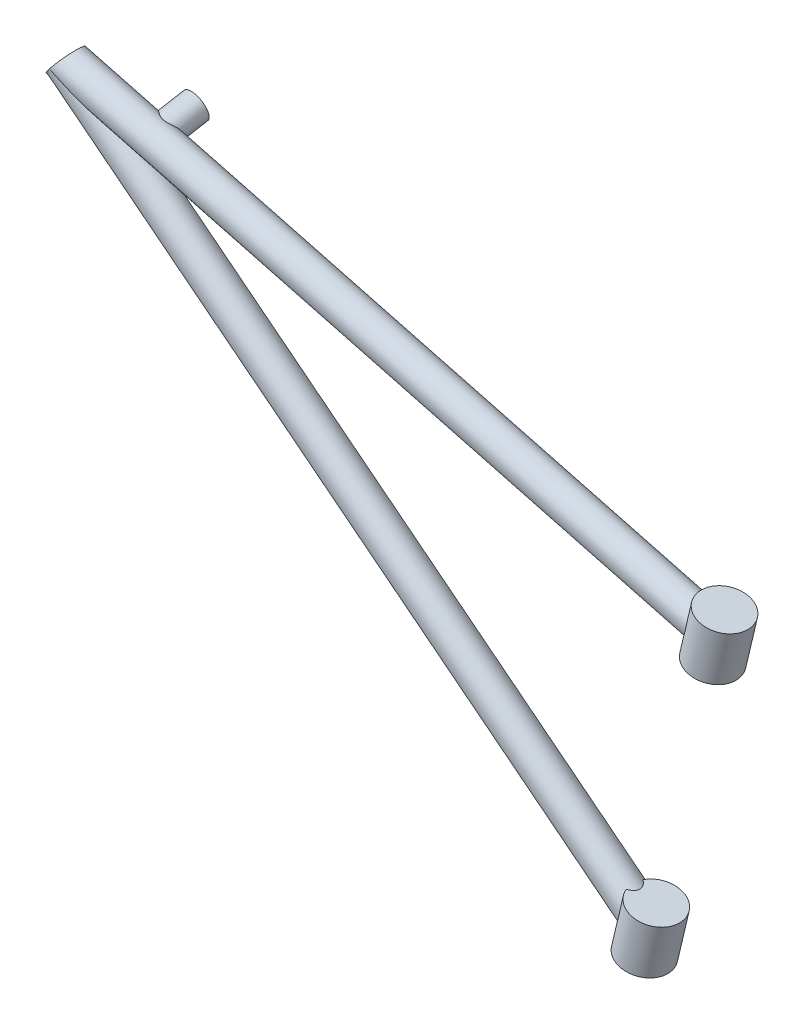
ISO-10303-21;
HEADER;
FILE_DESCRIPTION(('STEP AP214'),'2;1');
FILE_NAME('part.step','',(''),(''),'','','');
FILE_SCHEMA(('AUTOMOTIVE_DESIGN { 1 0 10303 214 1 1 1 1 }'));
ENDSEC;
DATA;
#1=APPLICATION_CONTEXT('core data for automotive mechanical design processes');
#2=APPLICATION_PROTOCOL_DEFINITION('international standard','automotive_design',2000,#1);
#3=PRODUCT_CONTEXT('',#1,'mechanical');
#4=PRODUCT('Part','Part','',(#3));
#5=PRODUCT_RELATED_PRODUCT_CATEGORY('part','',(#4));
#6=PRODUCT_DEFINITION_FORMATION('','',#4);
#7=PRODUCT_DEFINITION_CONTEXT('part definition',#1,'design');
#8=PRODUCT_DEFINITION('design','',#6,#7);
#9=PRODUCT_DEFINITION_SHAPE('','',#8);
#10=(LENGTH_UNIT() NAMED_UNIT(*) SI_UNIT(.MILLI.,.METRE.));
#11=(NAMED_UNIT(*) PLANE_ANGLE_UNIT() SI_UNIT($,.RADIAN.));
#12=(NAMED_UNIT(*) SI_UNIT($,.STERADIAN.) SOLID_ANGLE_UNIT());
#13=UNCERTAINTY_MEASURE_WITH_UNIT(LENGTH_MEASURE(1.E-05),#10,'distance_accuracy_value','');
#14=(GEOMETRIC_REPRESENTATION_CONTEXT(3) GLOBAL_UNCERTAINTY_ASSIGNED_CONTEXT((#13)) GLOBAL_UNIT_ASSIGNED_CONTEXT((#10,
#11,#12)) REPRESENTATION_CONTEXT('',''));
#15=CARTESIAN_POINT('',(0.,0.,0.));
#16=DIRECTION('',(0.,0.,1.));
#17=DIRECTION('',(1.,0.,0.));
#18=AXIS2_PLACEMENT_3D('',#15,#16,#17);
#19=CARTESIAN_POINT('',(-215.,1151.6011,-53.649));
#20=DIRECTION('',(-0.788508643665139,0.615015858971912,-0.00310033520835739));
#21=DIRECTION('',(-0.615018814783549,-0.788512433295911,0.));
#22=AXIS2_PLACEMENT_3D('',#19,#20,#21);
#23=CYLINDRICAL_SURFACE('',#22,9.525);
#24=CARTESIAN_POINT('',(-243.39562055654,1173.74893199642,-53.7606486710474));
#25=DIRECTION('',(0.230684760062267,0.973028498209276,0.000288353283411398));
#26=DIRECTION('',(-0.973022198051878,0.230684316193179,-0.00354236655039736));
#27=AXIS2_PLACEMENT_3D('',#24,#25,#26);
#28=ELLIPSE('',#27,22.8674930535986,9.525);
#29=CARTESIAN_POINT('',(-224.286262085042,1169.21993073521,-58.5827833271125));
#30=VERTEX_POINT('',#29);
#31=CARTESIAN_POINT('',(-224.320634321341,1169.225180437,-48.7995007985225));
#32=VERTEX_POINT('',#31);
#33=EDGE_CURVE('E105',#30,#32,#28,.F.);
#34=ORIENTED_EDGE('',*,*,#33,.F.);
#35=CARTESIAN_POINT('',(-224.320634321341,1169.225180437,-48.7995007985225));
#36=CARTESIAN_POINT('',(-224.295289207423,1169.09059523989,-48.6485355594731));
#37=CARTESIAN_POINT('',(-224.269502594691,1168.95160987775,-48.5016369115154));
#38=CARTESIAN_POINT('',(-224.217460516379,1168.66584174725,-48.2158483730908));
#39=CARTESIAN_POINT('',(-224.191205277724,1168.51906268832,-48.0769547371071));
#40=CARTESIAN_POINT('',(-224.138667081962,1168.21887651433,-47.8071750004393));
#41=CARTESIAN_POINT('',(-224.112384280659,1168.06548298792,-47.6762737035536));
#42=CARTESIAN_POINT('',(-224.060117173359,1167.75254967428,-47.4219621247782));
#43=CARTESIAN_POINT('',(-224.034132907183,1167.59300907918,-47.298552833037));
#44=CARTESIAN_POINT('',(-223.957136973827,1167.10586534488,-46.9390216085571));
#45=CARTESIAN_POINT('',(-223.907125055243,1166.76998067498,-46.713809774104));
#46=CARTESIAN_POINT('',(-223.81276926608,1166.08036007492,-46.2910710180656));
#47=CARTESIAN_POINT('',(-223.768428441769,1165.72661469185,-46.0935589701565));
#48=CARTESIAN_POINT('',(-223.692482337151,1165.03900047878,-45.7430462401006));
#49=CARTESIAN_POINT('',(-223.660064521758,1164.70646741956,-45.5875949874824));
#50=CARTESIAN_POINT('',(-223.605247829181,1164.03125571281,-45.2985848887143));
#51=CARTESIAN_POINT('',(-223.582847710299,1163.68857832828,-45.1650233306261));
#52=CARTESIAN_POINT('',(-223.551264109419,1162.99483116172,-44.9203286610457));
#53=CARTESIAN_POINT('',(-223.542073917122,1162.64376573279,-44.8091841869413));
#54=CARTESIAN_POINT('',(-223.540654640744,1161.93511851939,-44.6105914566239));
#55=CARTESIAN_POINT('',(-223.548419527181,1161.57753909623,-44.5231347890997));
#56=CARTESIAN_POINT('',(-223.591728976539,1160.73355915383,-44.3483048364498));
#57=CARTESIAN_POINT('',(-223.635922136758,1160.2452175784,-44.2713397563707));
#58=CARTESIAN_POINT('',(-223.739698948793,1159.51439261035,-44.1973134032289));
#59=CARTESIAN_POINT('',(-223.780506030959,1159.27120005024,-44.1795398917238));
#60=CARTESIAN_POINT('',(-223.875854045727,1158.78678991507,-44.1590549988136));
#61=CARTESIAN_POINT('',(-223.930395042434,1158.54557234923,-44.1563436877163));
#62=CARTESIAN_POINT('',(-224.054871038112,1158.06405215677,-44.1673837542468));
#63=CARTESIAN_POINT('',(-224.12500107534,1157.82380433931,-44.181354500947));
#64=CARTESIAN_POINT('',(-224.280401330248,1157.34999089194,-44.2273617054836));
#65=CARTESIAN_POINT('',(-224.365670871451,1157.11642496401,-44.2593973562663));
#66=CARTESIAN_POINT('',(-224.550567614918,1156.65864283163,-44.3423936701185));
#67=CARTESIAN_POINT('',(-224.650187433858,1156.43442189516,-44.3933446222576));
#68=CARTESIAN_POINT('',(-224.86212569037,1155.99750936304,-44.5145483765032));
#69=CARTESIAN_POINT('',(-224.974442851189,1155.78481661139,-44.5847992389658));
#70=CARTESIAN_POINT('',(-225.191087424431,1155.40463409945,-44.7320466579948));
#71=CARTESIAN_POINT('',(-225.293959076843,1155.23524453879,-44.80631437343));
#72=CARTESIAN_POINT('',(-225.50528074953,1154.9065164519,-44.9681794158287));
#73=CARTESIAN_POINT('',(-225.613732938815,1154.74718188818,-45.0557819519947));
#74=CARTESIAN_POINT('',(-225.834357534689,1154.43893292305,-45.2438062320331));
#75=CARTESIAN_POINT('',(-225.946531105204,1154.29002182791,-45.3442320151155));
#76=CARTESIAN_POINT('',(-226.172751379729,1154.00271207689,-45.5572829491347));
#77=CARTESIAN_POINT('',(-226.286798308782,1153.8643146954,-45.6699095749595));
#78=CARTESIAN_POINT('',(-226.521059223594,1153.59087193904,-45.912967181198));
#79=CARTESIAN_POINT('',(-226.641280572878,1153.45639033468,-46.0440245602015));
#80=CARTESIAN_POINT('',(-226.880011711337,1153.19866386453,-46.3181683650363));
#81=CARTESIAN_POINT('',(-226.998521482131,1153.07541911934,-46.4612549199345));
#82=CARTESIAN_POINT('',(-227.232179016608,1152.8397918452,-46.7587406524558));
#83=CARTESIAN_POINT('',(-227.347325968949,1152.72741192273,-46.9131425290829));
#84=CARTESIAN_POINT('',(-227.57271586912,1152.51320348435,-47.2324871004078));
#85=CARTESIAN_POINT('',(-227.682958494457,1152.41137566175,-47.3974304865487));
#86=CARTESIAN_POINT('',(-227.91478883551,1152.2020582696,-47.7650609369957));
#87=CARTESIAN_POINT('',(-228.035261038146,1152.0963912512,-47.9694943631884));
#88=CARTESIAN_POINT('',(-228.265752160391,1151.89856614401,-48.3904502736869));
#89=CARTESIAN_POINT('',(-228.375770122552,1151.80640929212,-48.6069738623902));
#90=CARTESIAN_POINT('',(-228.583652833395,1151.63530590534,-49.0509046031115));
#91=CARTESIAN_POINT('',(-228.681513852451,1151.55636342192,-49.2783150656136));
#92=CARTESIAN_POINT('',(-228.863515556458,1151.41154684608,-49.7425923124705));
#93=CARTESIAN_POINT('',(-228.947656277923,1151.3456727189,-49.9794590716571));
#94=CARTESIAN_POINT('',(-229.104160202246,1151.22436656883,-50.4714355906892));
#95=CARTESIAN_POINT('',(-229.175870386422,1151.16949773997,-50.7268927878857));
#96=CARTESIAN_POINT('',(-229.30170568039,1151.07381374639,-51.2446931910341));
#97=CARTESIAN_POINT('',(-229.355830136662,1151.03299910395,-51.507036652501));
#98=CARTESIAN_POINT('',(-229.445529959469,1150.96543066709,-52.0366091980168));
#99=CARTESIAN_POINT('',(-229.481109122684,1150.93867399466,-52.3038372704605));
#100=CARTESIAN_POINT('',(-229.533094783594,1150.89922397472,-52.841176424877));
#101=CARTESIAN_POINT('',(-229.549502067782,1150.88653005032,-53.1112873881254));
#102=CARTESIAN_POINT('',(-229.562602852696,1150.87542087448,-53.6424212189688));
#103=CARTESIAN_POINT('',(-229.55999265743,1150.87650236565,-53.9034167434214));
#104=CARTESIAN_POINT('',(-229.536731293886,1150.89173055095,-54.4242151822462));
#105=CARTESIAN_POINT('',(-229.516080545401,1150.90587694106,-54.6840181242275));
#106=CARTESIAN_POINT('',(-229.457074051506,1150.94722348577,-55.2005289023706));
#107=CARTESIAN_POINT('',(-229.418719841866,1150.97442250805,-55.4572370050269));
#108=CARTESIAN_POINT('',(-229.324926596394,1151.04186428499,-55.9657687486384));
#109=CARTESIAN_POINT('',(-229.269487466396,1151.08210711153,-56.2175923626644));
#110=CARTESIAN_POINT('',(-229.142935316919,1151.17525683397,-56.7125894774502));
#111=CARTESIAN_POINT('',(-229.071954994863,1151.22805682198,-56.9558170972995));
#112=CARTESIAN_POINT('',(-228.915166201555,1151.34653272991,-57.4342155058911));
#113=CARTESIAN_POINT('',(-228.829357822413,1151.41220856983,-57.6693863446706));
#114=CARTESIAN_POINT('',(-228.644188865129,1151.55656830355,-58.1303353799106));
#115=CARTESIAN_POINT('',(-228.544822192596,1151.63525805041,-58.3561092925963));
#116=CARTESIAN_POINT('',(-228.334087726109,1151.80580566917,-58.7968231124242));
#117=CARTESIAN_POINT('',(-228.222719654651,1151.89766384557,-59.0117627688809));
#118=CARTESIAN_POINT('',(-227.985290757245,1152.09856074262,-59.4374765664712));
#119=CARTESIAN_POINT('',(-227.858833402729,1152.20811807729,-59.6477852583267));
#120=CARTESIAN_POINT('',(-227.597000050461,1152.44215985744,-60.054091947955));
#121=CARTESIAN_POINT('',(-227.461623346321,1152.56664548585,-60.2500888096738));
#122=CARTESIAN_POINT('',(-227.184445881784,1152.83104256014,-60.6264138271711));
#123=CARTESIAN_POINT('',(-227.042647077319,1152.97094932768,-60.8067467054395));
#124=CARTESIAN_POINT('',(-226.755363006274,1153.26681642774,-61.1505013351463));
#125=CARTESIAN_POINT('',(-226.609878432523,1153.42277375979,-61.3139262359179));
#126=CARTESIAN_POINT('',(-226.342824344719,1153.72371503972,-61.5966577360825));
#127=CARTESIAN_POINT('',(-226.221339018976,1153.86614781129,-61.7187655348228));
#128=CARTESIAN_POINT('',(-225.979981444149,1154.16271310562,-61.9496161814568));
#129=CARTESIAN_POINT('',(-225.860108896456,1154.31684342644,-62.0583615346306));
#130=CARTESIAN_POINT('',(-225.624229262011,1154.63663394021,-62.2616660803098));
#131=CARTESIAN_POINT('',(-225.508217755384,1154.80228022846,-62.3562419603986));
#132=CARTESIAN_POINT('',(-225.282089586541,1155.14495226779,-62.5307434214336));
#133=CARTESIAN_POINT('',(-225.17197291344,1155.32197799786,-62.6106690294297));
#134=CARTESIAN_POINT('',(-224.959190023712,1155.68761446855,-62.7557996087947));
#135=CARTESIAN_POINT('',(-224.856564468665,1155.87627946014,-62.8209277883119));
#136=CARTESIAN_POINT('',(-224.661237833143,1156.26318881536,-62.9357724147125));
#137=CARTESIAN_POINT('',(-224.568536377274,1156.46143281624,-62.9854894446814));
#138=CARTESIAN_POINT('',(-224.394434085732,1156.86594068026,-63.0696863707433));
#139=CARTESIAN_POINT('',(-224.313032947956,1157.07220432882,-63.1041666742283));
#140=CARTESIAN_POINT('',(-224.162300581922,1157.49097492688,-63.1584073059781));
#141=CARTESIAN_POINT('',(-224.092970598108,1157.70348251746,-63.1781661172562));
#142=CARTESIAN_POINT('',(-223.957854047408,1158.16246560266,-63.2055004800131));
#143=CARTESIAN_POINT('',(-223.893867153004,1158.40959214042,-63.2110259573232));
#144=CARTESIAN_POINT('',(-223.781156826037,1158.90708309515,-63.2054279177171));
#145=CARTESIAN_POINT('',(-223.732435891857,1159.15744803513,-63.1943016773491));
#146=CARTESIAN_POINT('',(-223.648963411181,1159.65993837552,-63.1568028848643));
#147=CARTESIAN_POINT('',(-223.614245946277,1159.91206656964,-63.1303935121607));
#148=CARTESIAN_POINT('',(-223.557424839203,1160.4159253131,-63.0636288551156));
#149=CARTESIAN_POINT('',(-223.535325708187,1160.6676556882,-63.0232685914876));
#150=CARTESIAN_POINT('',(-223.493975928202,1161.29297924496,-62.9067113291572));
#151=CARTESIAN_POINT('',(-223.481481689577,1161.66556564527,-62.8226533010995));
#152=CARTESIAN_POINT('',(-223.475960464991,1162.40411320297,-62.6287679695519));
#153=CARTESIAN_POINT('',(-223.48294217018,1162.77007132916,-62.5189291814144));
#154=CARTESIAN_POINT('',(-223.51200981016,1163.49347214513,-62.2750042212048));
#155=CARTESIAN_POINT('',(-223.534107506928,1163.8509079793,-62.1408992270475));
#156=CARTESIAN_POINT('',(-223.589746146211,1164.55514036599,-61.8491637111948));
#157=CARTESIAN_POINT('',(-223.62328825752,1164.90193582789,-61.6915307875696));
#158=CARTESIAN_POINT('',(-223.702279469123,1165.61509098963,-61.3366418506304));
#159=CARTESIAN_POINT('',(-223.748554703177,1165.98019871388,-61.137048340388));
#160=CARTESIAN_POINT('',(-223.847550102805,1166.69187765871,-60.7087468537214));
#161=CARTESIAN_POINT('',(-223.900266593298,1167.03845928863,-60.4800554761369));
#162=CARTESIAN_POINT('',(-223.981669040053,1167.54070544438,-60.1143525560349));
#163=CARTESIAN_POINT('',(-224.009158447193,1167.70500562439,-59.9888300636568));
#164=CARTESIAN_POINT('',(-224.064536974263,1168.02720420642,-59.7299166212185));
#165=CARTESIAN_POINT('',(-224.092426037216,1168.1851035089,-59.5965267844526));
#166=CARTESIAN_POINT('',(-224.14825641266,1168.49402051598,-59.3213551888889));
#167=CARTESIAN_POINT('',(-224.176197714492,1168.64502338139,-59.179556716037));
#168=CARTESIAN_POINT('',(-224.231658194301,1168.93887124126,-58.8875319299619));
#169=CARTESIAN_POINT('',(-224.259177152742,1169.08171209155,-58.7373014108564));
#170=CARTESIAN_POINT('',(-224.286262085042,1169.21993073521,-58.5827833271127));
#171=B_SPLINE_CURVE_WITH_KNOTS('',3,(#35,#36,#37,#38,#39,#40,#41,#42,#43,#44,#45,#46,#47,#48,
#49,#50,#51,#52,#53,#54,#55,#56,#57,#58,#59,#60,#61,#62,#63,#64,#65,#66,#67,#68,#69,#70,#71,#72,
#73,#74,#75,#76,#77,#78,#79,#80,#81,#82,#83,#84,#85,#86,#87,#88,#89,#90,#91,#92,#93,#94,#95,#96,
#97,#98,#99,#100,#101,#102,#103,#104,#105,#106,#107,#108,#109,#110,#111,#112,#113,#114,#115,
#116,#117,#118,#119,#120,#121,#122,#123,#124,#125,#126,#127,#128,#129,#130,#131,#132,#133,#134,
#135,#136,#137,#138,#139,#140,#141,#142,#143,#144,#145,#146,#147,#148,#149,#150,#151,#152,#153,
#154,#155,#156,#157,#158,#159,#160,#161,#162,#163,#164,#165,#166,#167,#168,#169,#170),
.UNSPECIFIED.,.F.,.F.,(4,2,2,2,2,2,2,2,2,2,2,2,2,2,2,2,2,2,2,2,2,2,2,2,2,2,2,2,2,2,2,2,2,2,2,2,
2,2,2,2,2,2,2,2,2,2,2,2,2,2,2,2,2,2,2,2,2,2,2,2,2,2,2,2,2,2,2,4),(0.,0.611321113095376,
1.22235382943905,1.83218605530833,2.44209870234837,3.66289333627039,4.88434099855855,
5.98894252437587,7.09340709627885,8.19731043031255,9.3008212635092,10.7844934193154,
11.5255072719039,12.2665245834172,13.0173945439191,13.768230961792,14.5186824394653,
15.2690585242177,15.9032452299517,16.5376803173906,17.1723157415739,17.8070279688856,
18.4752867183987,19.1435526389086,19.8119784806388,20.4804482111198,21.258843318667,
22.0373096468022,22.8160142137426,23.5947167082833,24.4065344178047,25.2183822925516,
26.0300638965936,26.8417122016529,27.6237962912563,28.4058621827748,29.187860243073,
29.9698626134919,30.7454316380735,31.5209958450602,32.2969098201376,33.0728417402573,
33.8781372588605,34.68349663142,35.48861234955,36.2935778332745,36.9634458938148,
37.6331881707952,38.3021353757178,38.9710813454979,39.6434233396011,40.3157398923393,
40.9880384679274,41.6604063114264,42.4252747618273,43.1902683230497,43.9571126486431,
44.7242309558051,45.8689446439775,47.0141692429462,48.1602859732013,49.3065197888623,
50.5611680159512,51.8151037127785,52.4406454213905,53.066098822063,53.6928400783569,
54.319896778774),.UNSPECIFIED.);
#172=EDGE_CURVE('E92',#32,#30,#171,.T.);
#173=ORIENTED_EDGE('',*,*,#172,.F.);
#174=EDGE_LOOP('',(#34,#173));
#175=FACE_BOUND('',#174,.T.);
#176=CARTESIAN_POINT('',(-558.599999999999,1419.6,-55.));
#177=DIRECTION('',(-0.897008226583714,0.442000857679935,-0.00338869463695132));
#178=DIRECTION('',(0.441999884452041,0.897014466927656,0.00107157215105032));
#179=AXIS2_PLACEMENT_3D('',#176,#177,#178);
#180=ELLIPSE('',#179,9.72785711197768,9.525);
#181=CARTESIAN_POINT('',(-558.566535399132,1419.59488894593,-64.5249398422045));
#182=VERTEX_POINT('',#181);
#183=CARTESIAN_POINT('',(-558.633464600869,1419.60511105407,-45.4750601577955));
#184=VERTEX_POINT('',#183);
#185=EDGE_CURVE('E99',#182,#184,#180,.T.);
#186=ORIENTED_EDGE('',*,*,#185,.F.);
#187=CARTESIAN_POINT('',(-558.599999999999,1419.6,-55.));
#188=DIRECTION('',(0.441999884452041,0.897014466927656,0.00107157215105032));
#189=DIRECTION('',(-0.897008226583714,0.442000857679935,-0.00338869463695132));
#190=AXIS2_PLACEMENT_3D('',#187,#188,#189);
#191=ELLIPSE('',#190,46.8855974220386,9.525);
#192=EDGE_CURVE('E127',#184,#182,#191,.T.);
#193=ORIENTED_EDGE('',*,*,#192,.F.);
#194=EDGE_LOOP('',(#186,#193));
#195=FACE_BOUND('',#194,.T.);
#196=ADVANCED_FACE('F73',(#175,#195),#23,.T.);
#197=CARTESIAN_POINT('',(-175.,1320.3211,-53.599));
#198=DIRECTION('',(-0.968096795715719,0.250551577091192,-0.00353572369863849));
#199=DIRECTION('',(-0.250553143221362,-0.968102847027058,0.));
#200=AXIS2_PLACEMENT_3D('',#197,#198,#199);
#201=CYLINDRICAL_SURFACE('',#200,9.525);
#202=CARTESIAN_POINT('',(-506.05821924033,1415.2241564026,-58.1347477989266));
#203=CARTESIAN_POINT('',(-505.795994828892,1415.19666840026,-58.0286740653731));
#204=CARTESIAN_POINT('',(-505.52795587105,1415.15930587472,-57.9386649347427));
#205=CARTESIAN_POINT('',(-505.120565865821,1415.08892791519,-57.8370593471688));
#206=CARTESIAN_POINT('',(-504.984049883848,1415.06311963498,-57.8087730226554));
#207=CARTESIAN_POINT('',(-504.709939164784,1415.00688899087,-57.7644649706209));
#208=CARTESIAN_POINT('',(-504.572344476652,1414.97646683525,-57.7484426897035));
#209=CARTESIAN_POINT('',(-504.296267401007,1414.91103056288,-57.7294185014745));
#210=CARTESIAN_POINT('',(-504.157785903301,1414.87598440754,-57.7265129393203));
#211=CARTESIAN_POINT('',(-503.882296161004,1414.80181807583,-57.7341181110829));
#212=CARTESIAN_POINT('',(-503.745287914721,1414.76269790415,-57.7446288295834));
#213=CARTESIAN_POINT('',(-503.473757863949,1414.6806682912,-57.7785098805989));
#214=CARTESIAN_POINT('',(-503.339241280048,1414.63775178943,-57.801904615887));
#215=CARTESIAN_POINT('',(-503.073889961884,1414.5484898249,-57.860417795117));
#216=CARTESIAN_POINT('',(-502.943057640602,1414.50214218386,-57.8955437371969));
#217=CARTESIAN_POINT('',(-502.652121969153,1414.39371744273,-57.9865856380689));
#218=CARTESIAN_POINT('',(-502.493322096808,1414.33069889033,-58.0455368863949));
#219=CARTESIAN_POINT('',(-502.183341302371,1414.19984335179,-58.1766881969411));
#220=CARTESIAN_POINT('',(-502.032164955492,1414.13200352967,-58.2488960972252));
#221=CARTESIAN_POINT('',(-501.737218874016,1413.9913927858,-58.4039487253515));
#222=CARTESIAN_POINT('',(-501.593469841659,1413.91860926577,-58.4868211500486));
#223=CARTESIAN_POINT('',(-501.313713631881,1413.76820844483,-58.6606878419126));
#224=CARTESIAN_POINT('',(-501.177705239208,1413.69059190673,-58.7516808283878));
#225=CARTESIAN_POINT('',(-500.839699428106,1413.48582674263,-58.99217024455));
#226=CARTESIAN_POINT('',(-500.642997721654,1413.35510669161,-59.1460951478109));
#227=CARTESIAN_POINT('',(-500.267094584597,1413.08071699008,-59.4635737133153));
#228=CARTESIAN_POINT('',(-500.087902282858,1412.93704065884,-59.6271323278071));
#229=CARTESIAN_POINT('',(-499.747074844296,1412.63599731867,-59.9597601443064));
#230=CARTESIAN_POINT('',(-499.58543630891,1412.47863297052,-60.1288282713542));
#231=CARTESIAN_POINT('',(-499.280251010842,1412.14950532939,-60.4691552588051));
#232=CARTESIAN_POINT('',(-499.136698009044,1411.97774703623,-60.6404133411396));
#233=CARTESIAN_POINT('',(-498.890366593184,1411.64820256404,-60.9545976592721));
#234=CARTESIAN_POINT('',(-498.784747319834,1411.49264011232,-61.0976324444625));
#235=CARTESIAN_POINT('',(-498.587872707061,1411.17078964508,-61.3814925669084));
#236=CARTESIAN_POINT('',(-498.4966147263,1411.0045036098,-61.5223183061532));
#237=CARTESIAN_POINT('',(-498.3296923515,1410.66142862,-61.7998287973712));
#238=CARTESIAN_POINT('',(-498.25400547276,1410.48465529153,-61.936519273727));
#239=CARTESIAN_POINT('',(-498.119362812863,1410.12065787278,-62.204114172176));
#240=CARTESIAN_POINT('',(-498.060403265608,1409.93343614629,-62.3350198910742));
#241=CARTESIAN_POINT('',(-497.970405443146,1409.58695331281,-62.5641006117569));
#242=CARTESIAN_POINT('',(-497.936156765969,1409.42943115869,-62.6636509269345));
#243=CARTESIAN_POINT('',(-497.880058796661,1409.10858249396,-62.8566812496054));
#244=CARTESIAN_POINT('',(-497.858206760221,1408.94525727652,-62.950162596556));
#245=CARTESIAN_POINT('',(-497.827556285527,1408.61356881807,-63.1299600814791));
#246=CARTESIAN_POINT('',(-497.818753469237,1408.4452072861,-63.216278613409));
#247=CARTESIAN_POINT('',(-497.814727933359,1408.10435088455,-63.3807285709005));
#248=CARTESIAN_POINT('',(-497.819505379081,1407.93185596467,-63.4588598967892));
#249=CARTESIAN_POINT('',(-497.843069365958,1407.58295594395,-63.6063551052402));
#250=CARTESIAN_POINT('',(-497.861932865871,1407.40653454741,-63.6756683666586));
#251=CARTESIAN_POINT('',(-497.913890681605,1407.05209352976,-63.8041613581414));
#252=CARTESIAN_POINT('',(-497.946985024905,1406.87407390557,-63.8633410686381));
#253=CARTESIAN_POINT('',(-498.027253897897,1406.51798064859,-63.9709007207133));
#254=CARTESIAN_POINT('',(-498.074425939559,1406.3399070309,-64.0192825680195));
#255=CARTESIAN_POINT('',(-498.182427955002,1405.98522866052,-64.104851870461));
#256=CARTESIAN_POINT('',(-498.243257147862,1405.80862382443,-64.1420399653733));
#257=CARTESIAN_POINT('',(-498.371968667044,1405.47378205969,-64.2023211631809));
#258=CARTESIAN_POINT('',(-498.438761381768,1405.31529486325,-64.2263657362871));
#259=CARTESIAN_POINT('',(-498.582503430513,1405.00176781347,-64.2651395545726));
#260=CARTESIAN_POINT('',(-498.65945613585,1404.84672912447,-64.2798656982491));
#261=CARTESIAN_POINT('',(-498.822718517531,1404.5411214699,-64.3002438576545));
#262=CARTESIAN_POINT('',(-498.90902528013,1404.39055113097,-64.3058986904324));
#263=CARTESIAN_POINT('',(-499.090242887969,1404.09454462772,-64.3085403306844));
#264=CARTESIAN_POINT('',(-499.185156955666,1403.94911041485,-64.3055238786661));
#265=CARTESIAN_POINT('',(-499.38880086399,1403.65533311678,-64.290877736895));
#266=CARTESIAN_POINT('',(-499.498020511012,1403.50735521461,-64.2787330512044));
#267=CARTESIAN_POINT('',(-499.724297427409,1403.21847908955,-64.2459234274687));
#268=CARTESIAN_POINT('',(-499.841357767933,1403.0775836791,-64.2252551342397));
#269=CARTESIAN_POINT('',(-500.203051875816,1402.66613530322,-64.1515362195722));
#270=CARTESIAN_POINT('',(-500.458242392814,1402.40675784422,-64.0867678954963));
#271=CARTESIAN_POINT('',(-500.921519613025,1401.98341720811,-63.9523296432615));
#272=CARTESIAN_POINT('',(-501.124715579532,1401.81212831771,-63.8882613809189));
#273=CARTESIAN_POINT('',(-501.541518886866,1401.48764758081,-63.7489917960858));
#274=CARTESIAN_POINT('',(-501.75512661568,1401.33445640945,-63.6737900585011));
#275=CARTESIAN_POINT('',(-502.191970740252,1401.04630102428,-63.5147031489479));
#276=CARTESIAN_POINT('',(-502.415229228336,1400.91138190939,-63.4307973628946));
#277=CARTESIAN_POINT('',(-502.870084778859,1400.66077410948,-63.2572791732588));
#278=CARTESIAN_POINT('',(-503.10167960839,1400.54508032087,-63.1676682929279));
#279=CARTESIAN_POINT('',(-503.533120121419,1400.3516597638,-63.0012707490088));
#280=CARTESIAN_POINT('',(-503.73172574562,1400.27082068535,-62.9248728231581));
#281=CARTESIAN_POINT('',(-504.134549007913,1400.12387722672,-62.7725063498501));
#282=CARTESIAN_POINT('',(-504.338767577977,1400.0577753103,-62.6965378762546));
#283=CARTESIAN_POINT('',(-504.752371263347,1399.94174093136,-62.547929297337));
#284=CARTESIAN_POINT('',(-504.961741916754,1399.89176777044,-62.4752812179585));
#285=CARTESIAN_POINT('',(-505.385948654491,1399.809589006,-62.33657665779));
#286=CARTESIAN_POINT('',(-505.600781027277,1399.77737165711,-62.2705158433057));
#287=CARTESIAN_POINT('',(-506.082412399837,1399.7283474068,-62.1362365944351));
#288=CARTESIAN_POINT('',(-506.350505517141,1399.71630519477,-62.0705740866575));
#289=CARTESIAN_POINT('',(-506.755540132816,1399.72423991473,-61.9910722542764));
#290=CARTESIAN_POINT('',(-506.890942627104,1399.73120449756,-61.9677462326773));
#291=CARTESIAN_POINT('',(-507.162012892074,1399.75429025625,-61.9284874687962));
#292=CARTESIAN_POINT('',(-507.2976804878,1399.77040665978,-61.9125508810565));
#293=CARTESIAN_POINT('',(-507.569651155624,1399.81233072434,-61.8888247890267));
#294=CARTESIAN_POINT('',(-507.70594693387,1399.83823405442,-61.8811186819089));
#295=CARTESIAN_POINT('',(-507.976552299882,1399.89972453481,-61.8746294258284));
#296=CARTESIAN_POINT('',(-508.110861991977,1399.93531117453,-61.8758458064931));
#297=CARTESIAN_POINT('',(-508.376366331572,1400.0158498987,-61.8871560593602));
#298=CARTESIAN_POINT('',(-508.50755847496,1400.06080924599,-61.8972568356755));
#299=CARTESIAN_POINT('',(-508.765697122795,1400.15942273313,-61.9257648513275));
#300=CARTESIAN_POINT('',(-508.892642951287,1400.21307824942,-61.9441734064509));
#301=CARTESIAN_POINT('',(-509.164283735813,1400.33876853741,-61.9923628445568));
#302=CARTESIAN_POINT('',(-509.307992067519,1400.4123705537,-62.0236056910389));
#303=CARTESIAN_POINT('',(-509.587976166862,1400.56920759417,-62.0944370227592));
#304=CARTESIAN_POINT('',(-509.724245855175,1400.65245032892,-62.1340322092177));
#305=CARTESIAN_POINT('',(-509.989547629806,1400.82750223023,-62.2196961100785));
#306=CARTESIAN_POINT('',(-510.118559049719,1400.9193340531,-62.2657821175334));
#307=CARTESIAN_POINT('',(-510.369123687437,1401.1103149354,-62.3625384559407));
#308=CARTESIAN_POINT('',(-510.49067870232,1401.20946221893,-62.4132076749458));
#309=CARTESIAN_POINT('',(-510.798725216418,1401.47679318397,-62.5494272714532));
#310=CARTESIAN_POINT('',(-510.979617219959,1401.65020873917,-62.6374075589199));
#311=CARTESIAN_POINT('',(-511.324528059317,1402.01180338597,-62.8161491404656));
#312=CARTESIAN_POINT('',(-511.488537113842,1402.19999092581,-62.9069120075804));
#313=CARTESIAN_POINT('',(-511.800757428644,1402.58992748665,-63.0874409602691));
#314=CARTESIAN_POINT('',(-511.948947949773,1402.79169375896,-63.1772056023468));
#315=CARTESIAN_POINT('',(-512.229640958433,1403.20753751988,-63.35246357681));
#316=CARTESIAN_POINT('',(-512.362146676012,1403.42161246017,-63.4379577865228));
#317=CARTESIAN_POINT('',(-512.616356326274,1403.87010017677,-63.6052788118527));
#318=CARTESIAN_POINT('',(-512.737418305958,1404.10498362502,-63.6868231852371));
#319=CARTESIAN_POINT('',(-512.961817036514,1404.58637946406,-63.8396305448324));
#320=CARTESIAN_POINT('',(-513.065150609054,1404.83289392996,-63.9108916871113));
#321=CARTESIAN_POINT('',(-513.252678528003,1405.33574409345,-64.0402626651915));
#322=CARTESIAN_POINT('',(-513.336919527872,1405.59205402271,-64.0984045568316));
#323=CARTESIAN_POINT('',(-513.485032624965,1406.11344600655,-64.1990907307096));
#324=CARTESIAN_POINT('',(-513.548914844448,1406.37852362929,-64.2416427657068));
#325=CARTESIAN_POINT('',(-513.638454366176,1406.83338112402,-64.2983770407043));
#326=CARTESIAN_POINT('',(-513.669827637314,1407.02146943121,-64.3172536241348));
#327=CARTESIAN_POINT('',(-513.72128855119,1407.39987890119,-64.3454246864472));
#328=CARTESIAN_POINT('',(-513.741379161351,1407.59019946344,-64.3547216853679));
#329=CARTESIAN_POINT('',(-513.769694420632,1407.97187275628,-64.3629966321357));
#330=CARTESIAN_POINT('',(-513.777924582902,1408.16322496579,-64.3619793761777));
#331=CARTESIAN_POINT('',(-513.782041318648,1408.54571812074,-64.3490269153205));
#332=CARTESIAN_POINT('',(-513.777927571543,1408.73685906056,-64.3370914268733));
#333=CARTESIAN_POINT('',(-513.756935652781,1409.11859997989,-64.3017613004406));
#334=CARTESIAN_POINT('',(-513.739977843484,1409.3091891072,-64.2782954906032));
#335=CARTESIAN_POINT('',(-513.693044437649,1409.68694798067,-64.2196719030316));
#336=CARTESIAN_POINT('',(-513.663068863013,1409.87411773259,-64.1845141449676));
#337=CARTESIAN_POINT('',(-513.59019426035,1410.24328473032,-64.102594398372));
#338=CARTESIAN_POINT('',(-513.547298501388,1410.42528327182,-64.0558353457264));
#339=CARTESIAN_POINT('',(-513.448924163338,1410.78250845387,-63.951074866314));
#340=CARTESIAN_POINT('',(-513.393446452602,1410.95773556078,-63.8930742154357));
#341=CARTESIAN_POINT('',(-513.276373701474,1411.28359112955,-63.7725219673158));
#342=CARTESIAN_POINT('',(-513.215868616183,1411.43497076397,-63.7109337597232));
#343=CARTESIAN_POINT('',(-513.085597400683,1411.73012004654,-63.5796922284096));
#344=CARTESIAN_POINT('',(-513.0158281562,1411.87388711278,-63.5100361935868));
#345=CARTESIAN_POINT('',(-512.867730603431,1412.15298127141,-63.3634376129753));
#346=CARTESIAN_POINT('',(-512.789404463549,1412.28831048844,-63.2864969138492));
#347=CARTESIAN_POINT('',(-512.624866981099,1412.55008439062,-63.1260981391587));
#348=CARTESIAN_POINT('',(-512.538652665649,1412.6765256941,-63.0426376081571));
#349=CARTESIAN_POINT('',(-512.355055729518,1412.92559568744,-62.8661891264595));
#350=CARTESIAN_POINT('',(-512.257345654404,1413.04779913919,-62.772941766813));
#351=CARTESIAN_POINT('',(-512.054921626046,1413.28190677277,-62.5812256297373));
#352=CARTESIAN_POINT('',(-511.950204946454,1413.39380690474,-62.4827548229318));
#353=CARTESIAN_POINT('',(-511.626703057487,1413.71391305535,-62.1809432997954));
#354=CARTESIAN_POINT('',(-511.398451972808,1413.9066773105,-61.9710933893625));
#355=CARTESIAN_POINT('',(-510.984782226369,1414.20630467269,-61.5979855349932));
#356=CARTESIAN_POINT('',(-510.803856154702,1414.32243254312,-61.4369639205083));
#357=CARTESIAN_POINT('',(-510.432463162088,1414.53364883067,-61.1119347478326));
#358=CARTESIAN_POINT('',(-510.241992363297,1414.62872860994,-60.9479259935328));
#359=CARTESIAN_POINT('',(-509.851866197598,1414.79896382207,-60.6189129837171));
#360=CARTESIAN_POINT('',(-509.652178898587,1414.87404275301,-60.45390730662));
#361=CARTESIAN_POINT('',(-509.244820116534,1415.00469099129,-60.1261397840829));
#362=CARTESIAN_POINT('',(-509.037150038608,1415.06026371479,-59.963377550546));
#363=CARTESIAN_POINT('',(-508.612155864172,1415.1530470605,-59.6417180003127));
#364=CARTESIAN_POINT('',(-508.394768450349,1415.19010911983,-59.48286138582));
#365=CARTESIAN_POINT('',(-507.951342222751,1415.24582038492,-59.1739335507879));
#366=CARTESIAN_POINT('',(-507.725298994985,1415.26446006282,-59.0238669140395));
#367=CARTESIAN_POINT('',(-507.264825343756,1415.28359878907,-58.7380760247879));
#368=CARTESIAN_POINT('',(-507.030436011866,1415.28417696898,-58.6022918075145));
#369=CARTESIAN_POINT('',(-506.551848785377,1415.26751774034,-58.3510938377469));
#370=CARTESIAN_POINT('',(-506.307664833727,1415.25030484934,-58.235652307645));
#371=CARTESIAN_POINT('',(-506.05821924033,1415.2241564026,-58.1347477989266));
#372=B_SPLINE_CURVE_WITH_KNOTS('',3,(#202,#203,#204,#205,#206,#207,#208,#209,#210,#211,#212,
#213,#214,#215,#216,#217,#218,#219,#220,#221,#222,#223,#224,#225,#226,#227,#228,#229,#230,#231,
#232,#233,#234,#235,#236,#237,#238,#239,#240,#241,#242,#243,#244,#245,#246,#247,#248,#249,#250,
#251,#252,#253,#254,#255,#256,#257,#258,#259,#260,#261,#262,#263,#264,#265,#266,#267,#268,#269,
#270,#271,#272,#273,#274,#275,#276,#277,#278,#279,#280,#281,#282,#283,#284,#285,#286,#287,#288,
#289,#290,#291,#292,#293,#294,#295,#296,#297,#298,#299,#300,#301,#302,#303,#304,#305,#306,#307,
#308,#309,#310,#311,#312,#313,#314,#315,#316,#317,#318,#319,#320,#321,#322,#323,#324,#325,#326,
#327,#328,#329,#330,#331,#332,#333,#334,#335,#336,#337,#338,#339,#340,#341,#342,#343,#344,#345,
#346,#347,#348,#349,#350,#351,#352,#353,#354,#355,#356,#357,#358,#359,#360,#361,#362,#363,#364,
#365,#366,#367,#368,#369,#370,#371),.UNSPECIFIED.,.T.,.F.,(4,2,2,2,2,2,2,2,2,2,2,2,2,2,2,2,2,2,
2,2,2,2,2,2,2,2,2,2,2,2,2,2,2,2,2,2,2,2,2,2,2,2,2,2,2,2,2,2,2,2,2,2,2,2,2,2,2,2,2,2,2,2,2,2,2,2,
2,2,2,2,2,2,2,2,2,2,2,2,2,2,2,2,2,2,4),(0.,0.851737701881528,1.27657428337337,1.70139169362392,
2.12932445638049,2.55725672740992,2.98600231844787,3.41502247337535,3.95635447641804,
4.49800758164979,5.04109693083845,5.58410078039278,6.42863549612818,7.27360820284659,
8.11841702272451,8.96293359922476,9.67105299680209,10.379042004089,11.0860013849385,
11.7928014699059,12.3606508682953,12.928374509883,13.4959076360637,14.0634476707277,
14.6341113410551,15.2047761133126,15.7753400884852,16.345871446974,16.8662643555209,
17.3868303782569,17.9072347105764,18.4278346858519,18.980242572059,19.5328681128042,
20.6378926249164,21.4570773282591,22.2762925813171,23.0974943318635,23.9184777349337,
24.6008723904287,25.2833810433242,25.9641537768978,26.6444756404603,27.4701865957289,
27.882490873273,28.2945803463956,28.7108069068372,29.1270115249517,29.5435398640148,
29.9601341960384,30.4527242010418,30.9457109326457,31.440036854951,31.9342431673316,
32.7297974898107,33.5258101601309,34.3228539592575,35.1197333326933,35.9484086163804,
36.777232309385,37.6040083630791,38.4303727052141,39.0047099554489,39.5788960799244,
40.1528152164066,40.7267492580763,41.3042713210952,41.8817924125155,42.4591675021561,
43.0365027558948,43.5587101089689,44.081093455829,44.603344731258,45.1257936491114,
45.6716710519032,46.2177621109404,47.3092904233779,48.1141767058162,48.9193926926184,
49.7276457389556,50.5357571636418,51.3502540959821,52.1651720578581,52.9765191736766,
53.786749675481),.UNSPECIFIED.);
#373=CARTESIAN_POINT('',(-506.05821924033,1415.2241564026,-58.1347477989266));
#374=VERTEX_POINT('',#373);
#375=EDGE_CURVE('E12',#374,#374,#372,.T.);
#376=ORIENTED_EDGE('',*,*,#375,.F.);
#377=EDGE_LOOP('',(#376));
#378=FACE_BOUND('',#377,.T.);
#379=CARTESIAN_POINT('',(-190.753939195461,1314.55952101737,-53.6478210535175));
#380=CARTESIAN_POINT('',(-190.753173276137,1314.55932352662,-53.8874819712135));
#381=CARTESIAN_POINT('',(-190.744347125622,1314.56639484963,-54.127133975741));
#382=CARTESIAN_POINT('',(-190.71075571716,1314.59498073899,-54.6044527277699));
#383=CARTESIAN_POINT('',(-190.685989540937,1314.61649613745,-54.8421193600982));
#384=CARTESIAN_POINT('',(-190.621032728392,1314.67370023612,-55.3137218601182));
#385=CARTESIAN_POINT('',(-190.580834245694,1314.70939614656,-55.547655766826));
#386=CARTESIAN_POINT('',(-190.48584676052,1314.79452200271,-56.0099791079303));
#387=CARTESIAN_POINT('',(-190.431057771031,1314.8439519362,-56.2383685472621));
#388=CARTESIAN_POINT('',(-190.308254983543,1314.95573315487,-56.6870713684654));
#389=CARTESIAN_POINT('',(-190.24030531069,1315.01802187907,-56.9074179891311));
#390=CARTESIAN_POINT('',(-190.092242541731,1315.1550712723,-57.3399734740079));
#391=CARTESIAN_POINT('',(-190.012129472565,1315.22983191371,-57.5521823562414));
#392=CARTESIAN_POINT('',(-189.84108895378,1315.39121656418,-57.9674608202499));
#393=CARTESIAN_POINT('',(-189.750163613113,1315.47783826022,-58.1705321736977));
#394=CARTESIAN_POINT('',(-189.558844298662,1315.66243521111,-58.5668985191001));
#395=CARTESIAN_POINT('',(-189.458446804482,1315.76041469027,-58.7601898349033));
#396=CARTESIAN_POINT('',(-189.240922696546,1315.97584539456,-59.1520214270591));
#397=CARTESIAN_POINT('',(-189.123099194351,1316.09423887925,-59.3496565831249));
#398=CARTESIAN_POINT('',(-188.879812171168,1316.34332315267,-59.7321832057202));
#399=CARTESIAN_POINT('',(-188.754345350303,1316.47401926633,-59.9170690934688));
#400=CARTESIAN_POINT('',(-188.497479795171,1316.74752979453,-60.2737962759467));
#401=CARTESIAN_POINT('',(-188.366072973456,1316.89036097895,-60.4456188761465));
#402=CARTESIAN_POINT('',(-188.099439552992,1317.18775611879,-60.7754449671732));
#403=CARTESIAN_POINT('',(-187.964214216859,1317.34231622385,-60.9334529567109));
#404=CARTESIAN_POINT('',(-187.670667191836,1317.68818460187,-61.2587751225514));
#405=CARTESIAN_POINT('',(-187.512026137735,1317.88146851752,-61.4237108335926));
#406=CARTESIAN_POINT('',(-187.195476461372,1318.28397071489,-61.7338255596395));
#407=CARTESIAN_POINT('',(-187.037568021286,1318.49319275592,-61.8789998908875));
#408=CARTESIAN_POINT('',(-186.726467155519,1318.92743566851,-62.148229603562));
#409=CARTESIAN_POINT('',(-186.573266845149,1319.15242779309,-62.2723220696339));
#410=CARTESIAN_POINT('',(-186.27538978657,1319.61876958345,-62.4983197574415));
#411=CARTESIAN_POINT('',(-186.130713066173,1319.8601193026,-62.600224906784));
#412=CARTESIAN_POINT('',(-185.8961508264,1320.28357772402,-62.7530015433697));
#413=CARTESIAN_POINT('',(-185.802890326575,1320.46162664385,-62.8099984758332));
#414=CARTESIAN_POINT('',(-185.624452256442,1320.82503024277,-62.9116802923861));
#415=CARTESIAN_POINT('',(-185.539269476336,1321.01038010234,-62.9563731479945));
#416=CARTESIAN_POINT('',(-185.378603479192,1321.38753946652,-63.0328474108784));
#417=CARTESIAN_POINT('',(-185.303107246393,1321.57933985649,-63.0646462706239));
#418=CARTESIAN_POINT('',(-185.163043472864,1321.96861509383,-63.1149416436986));
#419=CARTESIAN_POINT('',(-185.09847605389,1322.16609000438,-63.1334380088355));
#420=CARTESIAN_POINT('',(-184.981065993868,1322.56611441825,-63.1568806882635));
#421=CARTESIAN_POINT('',(-184.928268998185,1322.76868039991,-63.1617750672427));
#422=CARTESIAN_POINT('',(-184.835256243172,1323.17653970493,-63.1578218281094));
#423=CARTESIAN_POINT('',(-184.795040260688,1323.38183297984,-63.148974453756));
#424=CARTESIAN_POINT('',(-184.727144716963,1323.79366202198,-63.1177400358333));
#425=CARTESIAN_POINT('',(-184.69947794484,1324.00019884036,-63.0953392337324));
#426=CARTESIAN_POINT('',(-184.656210799934,1324.41270806028,-63.0374228992829));
#427=CARTESIAN_POINT('',(-184.640612905695,1324.61868033724,-63.0019046752663));
#428=CARTESIAN_POINT('',(-184.618751170142,1325.06579843923,-62.9107435297436));
#429=CARTESIAN_POINT('',(-184.614693912215,1325.3065467072,-62.8526186902304));
#430=CARTESIAN_POINT('',(-184.620178123392,1325.78329016911,-62.7199128906776));
#431=CARTESIAN_POINT('',(-184.629722539503,1326.01928432177,-62.6453283673611));
#432=CARTESIAN_POINT('',(-184.660255999537,1326.48527926654,-62.4806248191313));
#433=CARTESIAN_POINT('',(-184.681257098936,1326.71527347752,-62.3904894990802));
#434=CARTESIAN_POINT('',(-184.732559890817,1327.16784350322,-62.1956367216974));
#435=CARTESIAN_POINT('',(-184.762861319196,1327.39041952841,-62.0909196784936));
#436=CARTESIAN_POINT('',(-184.865911822417,1328.05385985535,-61.7518083902875));
#437=CARTESIAN_POINT('',(-184.950111250602,1328.48194494949,-61.4954738528022));
#438=CARTESIAN_POINT('',(-185.133822788399,1329.29758942415,-60.9292388650454));
#439=CARTESIAN_POINT('',(-185.233342425093,1329.68512872577,-60.6193120747022));
#440=CARTESIAN_POINT('',(-185.396286649879,1330.27137728801,-60.0788218089472));
#441=CARTESIAN_POINT('',(-185.458754556981,1330.4850666954,-59.8640425597593));
#442=CARTESIAN_POINT('',(-185.582426558913,1330.89268542503,-59.4159634068953));
#443=CARTESIAN_POINT('',(-185.643630396179,1331.08661075126,-59.1826597747452));
#444=CARTESIAN_POINT('',(-185.762335459443,1331.45218421076,-58.6986784073366));
#445=CARTESIAN_POINT('',(-185.819840326108,1331.62385442277,-58.4480182757927));
#446=CARTESIAN_POINT('',(-185.928984648582,1331.94260903194,-57.9303515724569));
#447=CARTESIAN_POINT('',(-185.980626347743,1332.08970284269,-57.6633513132824));
#448=CARTESIAN_POINT('',(-186.064147843548,1332.32356572651,-57.1828384878096));
#449=CARTESIAN_POINT('',(-186.097752101616,1332.41624778731,-56.9724868639357));
#450=CARTESIAN_POINT('',(-186.159676195115,1332.58513618912,-56.5445323049793));
#451=CARTESIAN_POINT('',(-186.187997152762,1332.66134602951,-56.3269309214038));
#452=CARTESIAN_POINT('',(-186.238627519419,1332.79622533821,-55.8858360715992));
#453=CARTESIAN_POINT('',(-186.260941253334,1332.85490742899,-55.662346972188));
#454=CARTESIAN_POINT('',(-186.299000364562,1332.95393421736,-55.2107718407871));
#455=CARTESIAN_POINT('',(-186.314745578389,1332.99427845854,-54.9826856945277));
#456=CARTESIAN_POINT('',(-186.339285132057,1333.05608805207,-54.5227632708627));
#457=CARTESIAN_POINT('',(-186.348054615067,1333.07748592261,-54.2909165601384));
#458=CARTESIAN_POINT('',(-186.358312459469,1333.10079576062,-53.82608160722));
#459=CARTESIAN_POINT('',(-186.359800830609,1333.10270775418,-53.593093366555));
#460=CARTESIAN_POINT('',(-186.355470246828,1333.08701359718,-53.1278233888262));
#461=CARTESIAN_POINT('',(-186.349650556795,1333.06940548314,-52.8955417251923));
#462=CARTESIAN_POINT('',(-186.33088876191,1333.01496921863,-52.4335435709002));
#463=CARTESIAN_POINT('',(-186.31794682275,1332.97814151529,-52.2038270206933));
#464=CARTESIAN_POINT('',(-186.286194495221,1332.88832829191,-51.760774671337));
#465=CARTESIAN_POINT('',(-186.267732647408,1332.83630579613,-51.5472172471947));
#466=CARTESIAN_POINT('',(-186.225230658051,1332.71626929353,-51.1251439688765));
#467=CARTESIAN_POINT('',(-186.201188587855,1332.64824975766,-50.9166298853708));
#468=CARTESIAN_POINT('',(-186.14811517242,1332.49710320011,-50.5058861719436));
#469=CARTESIAN_POINT('',(-186.119085164448,1332.41398022732,-50.3036548747222));
#470=CARTESIAN_POINT('',(-186.056683514999,1332.23351841698,-49.9062611522535));
#471=CARTESIAN_POINT('',(-186.023310282131,1332.1361743671,-49.7111013517311));
#472=CARTESIAN_POINT('',(-185.94999474642,1331.91950850595,-49.31256926022));
#473=CARTESIAN_POINT('',(-185.90973605236,1331.79902700764,-49.1098859830114));
#474=CARTESIAN_POINT('',(-185.825943032636,1331.54367220568,-48.7144141817806));
#475=CARTESIAN_POINT('',(-185.782407331804,1331.40879285005,-48.5216298695031));
#476=CARTESIAN_POINT('',(-185.693090061034,1331.12577289579,-48.1465066033552));
#477=CARTESIAN_POINT('',(-185.647307670951,1330.9776274379,-47.9641715173833));
#478=CARTESIAN_POINT('',(-185.554587160773,1330.66915883348,-47.6104135050218));
#479=CARTESIAN_POINT('',(-185.507648909479,1330.50883430017,-47.4389918253873));
#480=CARTESIAN_POINT('',(-185.405529917009,1330.14791834102,-47.0783761657935));
#481=CARTESIAN_POINT('',(-185.350343687659,1329.94518910973,-46.8913190550529));
#482=CARTESIAN_POINT('',(-185.241881973975,1329.52557208121,-46.5331748294722));
#483=CARTESIAN_POINT('',(-185.188606785969,1329.30868210278,-46.3620901848025));
#484=CARTESIAN_POINT('',(-185.086072541563,1328.86182620662,-46.0363044005713));
#485=CARTESIAN_POINT('',(-185.036815828541,1328.63185279007,-45.8816128051318));
#486=CARTESIAN_POINT('',(-184.944722130874,1328.16006584648,-45.5893457115036));
#487=CARTESIAN_POINT('',(-184.901884218953,1327.91825403634,-45.4517677415229));
#488=CARTESIAN_POINT('',(-184.830045775968,1327.4547018407,-45.2105447246641));
#489=CARTESIAN_POINT('',(-184.799986241843,1327.23421384418,-45.1048075479443));
#490=CARTESIAN_POINT('',(-184.748774030131,1326.78584712572,-44.9077432078227));
#491=CARTESIAN_POINT('',(-184.727621306168,1326.55796844227,-44.8164159693926));
#492=CARTESIAN_POINT('',(-184.696347198844,1326.09626942506,-44.6491714394377));
#493=CARTESIAN_POINT('',(-184.68620802866,1325.86245929749,-44.573229462681));
#494=CARTESIAN_POINT('',(-184.67903132957,1325.38996819197,-44.4375771914747));
#495=CARTESIAN_POINT('',(-184.681990869216,1325.15128831575,-44.3778632684163));
#496=CARTESIAN_POINT('',(-184.701113937431,1324.71315583905,-44.2846885314263));
#497=CARTESIAN_POINT('',(-184.714864220245,1324.51418526346,-44.2484577267921));
#498=CARTESIAN_POINT('',(-184.753454086789,1324.11547586847,-44.1882676646681));
#499=CARTESIAN_POINT('',(-184.778291442209,1323.91573721144,-44.1643059433826));
#500=CARTESIAN_POINT('',(-184.839575239762,1323.51707439087,-44.1290913982558));
#501=CARTESIAN_POINT('',(-184.876012305947,1323.3181497005,-44.1178283434682));
#502=CARTESIAN_POINT('',(-184.960610702788,1322.92248327026,-44.1082216390922));
#503=CARTESIAN_POINT('',(-185.0087722333,1322.72574156767,-44.1098782097471));
#504=CARTESIAN_POINT('',(-185.116448777112,1322.3359358264,-44.1261293389288));
#505=CARTESIAN_POINT('',(-185.175963949373,1322.14287183925,-44.1407240786109));
#506=CARTESIAN_POINT('',(-185.305526466112,1321.76174113289,-44.1826384041491));
#507=CARTESIAN_POINT('',(-185.375573741006,1321.57367438066,-44.2099579059361));
#508=CARTESIAN_POINT('',(-185.525107495252,1321.20339231672,-44.2769538630643));
#509=CARTESIAN_POINT('',(-185.60460312216,1321.02118289626,-44.3166423549069));
#510=CARTESIAN_POINT('',(-185.771633917045,1320.66344516805,-44.4078651697605));
#511=CARTESIAN_POINT('',(-185.859173660085,1320.48792074366,-44.4594062592457));
#512=CARTESIAN_POINT('',(-186.067552294938,1320.09342535133,-44.5906059998254));
#513=CARTESIAN_POINT('',(-186.190604764323,1319.87688487849,-44.6740750180193));
#514=CARTESIAN_POINT('',(-186.444530514028,1319.45626849778,-44.858702392554));
#515=CARTESIAN_POINT('',(-186.575406603965,1319.25219712167,-44.9598671292057));
#516=CARTESIAN_POINT('',(-186.84216519874,1318.85635167945,-45.1789295170187));
#517=CARTESIAN_POINT('',(-186.978053010163,1318.6645912736,-45.2968453046592));
#518=CARTESIAN_POINT('',(-187.252036303826,1318.29345418746,-45.5484468412848));
#519=CARTESIAN_POINT('',(-187.390131649517,1318.11407674484,-45.6821316181053));
#520=CARTESIAN_POINT('',(-187.668826468743,1317.76414398747,-45.9673274821298));
#521=CARTESIAN_POINT('',(-187.809422639033,1317.5938268329,-46.119133685765));
#522=CARTESIAN_POINT('',(-188.088158414499,1317.26570662138,-46.4378804637019));
#523=CARTESIAN_POINT('',(-188.226297392594,1317.10790672432,-46.6048248368548));
#524=CARTESIAN_POINT('',(-188.497931510532,1316.80490108163,-46.9533357011089));
#525=CARTESIAN_POINT('',(-188.631426199408,1316.65969655701,-47.13490360653));
#526=CARTESIAN_POINT('',(-188.891690618255,1316.38211379078,-47.5121778541811));
#527=CARTESIAN_POINT('',(-189.018459351595,1316.24973744763,-47.7078862816179));
#528=CARTESIAN_POINT('',(-189.279745979003,1315.98125583595,-48.1402327111003));
#529=CARTESIAN_POINT('',(-189.413000394817,1315.84705882036,-48.3788297547625));
#530=CARTESIAN_POINT('',(-189.665179366286,1315.59667697649,-48.8723600257526));
#531=CARTESIAN_POINT('',(-189.784110343366,1315.48048406993,-49.1272858535176));
#532=CARTESIAN_POINT('',(-190.004688346199,1315.26725911924,-49.6518284776941));
#533=CARTESIAN_POINT('',(-190.106355604091,1315.17020462412,-49.9214275813983));
#534=CARTESIAN_POINT('',(-190.289791434439,1314.99633830584,-50.473574235218));
#535=CARTESIAN_POINT('',(-190.371568114587,1314.91951823377,-50.7561164535332));
#536=CARTESIAN_POINT('',(-190.493594140676,1314.80528196961,-51.2532766092158));
#537=CARTESIAN_POINT('',(-190.53908902951,1314.7628311576,-51.4654743048959));
#538=CARTESIAN_POINT('',(-190.617480225738,1314.68968177169,-51.8941629273531));
#539=CARTESIAN_POINT('',(-190.650379035156,1314.65898086384,-52.1106529925198));
#540=CARTESIAN_POINT('',(-190.702969572811,1314.60966175048,-52.546501385509));
#541=CARTESIAN_POINT('',(-190.722667061322,1314.59103827521,-52.7658584197033));
#542=CARTESIAN_POINT('',(-190.748505451264,1314.56605831575,-53.2060864141235));
#543=CARTESIAN_POINT('',(-190.754645041248,1314.55970301827,-53.4269575187319));
#544=CARTESIAN_POINT('',(-190.753939195461,1314.55952101737,-53.6478210535175));
#545=B_SPLINE_CURVE_WITH_KNOTS('',3,(#379,#380,#381,#382,#383,#384,#385,#386,#387,#388,#389,
#390,#391,#392,#393,#394,#395,#396,#397,#398,#399,#400,#401,#402,#403,#404,#405,#406,#407,#408,
#409,#410,#411,#412,#413,#414,#415,#416,#417,#418,#419,#420,#421,#422,#423,#424,#425,#426,#427,
#428,#429,#430,#431,#432,#433,#434,#435,#436,#437,#438,#439,#440,#441,#442,#443,#444,#445,#446,
#447,#448,#449,#450,#451,#452,#453,#454,#455,#456,#457,#458,#459,#460,#461,#462,#463,#464,#465,
#466,#467,#468,#469,#470,#471,#472,#473,#474,#475,#476,#477,#478,#479,#480,#481,#482,#483,#484,
#485,#486,#487,#488,#489,#490,#491,#492,#493,#494,#495,#496,#497,#498,#499,#500,#501,#502,#503,
#504,#505,#506,#507,#508,#509,#510,#511,#512,#513,#514,#515,#516,#517,#518,#519,#520,#521,#522,
#523,#524,#525,#526,#527,#528,#529,#530,#531,#532,#533,#534,#535,#536,#537,#538,#539,#540,#541,
#542,#543,#544),.UNSPECIFIED.,.T.,.F.,(4,2,2,2,2,2,2,2,2,2,2,2,2,2,2,2,2,2,2,2,2,2,2,2,2,2,2,2,
2,2,2,2,2,2,2,2,2,2,2,2,2,2,2,2,2,2,2,2,2,2,2,2,2,2,2,2,2,2,2,2,2,2,2,2,2,2,2,2,2,2,2,2,2,2,2,2,
2,2,2,2,2,2,4),(0.,0.718761889194264,1.43756518875109,2.15673444055629,2.87590305219343,
3.59165189138774,4.30739914533746,5.02300701994356,5.73888191110378,6.51441922460631,
7.29029376944305,8.06725852709305,8.84396931732261,9.74155422161301,10.639351498581,
11.5355527495362,12.4317569245883,13.0579455386586,13.6837275001299,14.3086595937207,
14.9335986490664,15.5609205993016,16.1882314218648,16.8161801192703,17.4442577421181,
18.1862737774696,18.928450606119,19.6714099126252,20.4143481230415,21.9270801279758,
23.4405577502841,24.3675621714748,25.2947536497084,26.2210181283394,27.1469269985311,
27.8431599710917,28.5392448893626,29.2348273125878,29.930427047431,30.628494467083,
31.3265609519557,32.0246976601979,32.7228181275145,33.3838265046773,34.0450636825419,
34.7061238585141,35.3674269376293,36.084328300426,36.8015322001708,37.5189998886248,
38.2365493945451,39.0796230280813,39.9228268292241,40.7665188818787,41.6100889347411,
42.3485686025597,43.0870444252105,43.8243258324591,44.561442246966,45.1689467891595,
45.7763292884442,46.3832220868541,46.9901252311094,47.5970368731232,48.203944505494,
48.8114445852049,49.4192923425664,50.2061738259689,50.9933396118333,51.7813642567751,
52.5693403450419,53.3725782163624,54.176018217174,54.9795360164806,55.7831725478809,
56.6952773903345,57.6069717875684,58.517590242,59.4278368905536,60.0905809167669,
60.7531932303764,61.4155162306405,62.0779032941745),.UNSPECIFIED.);
#546=CARTESIAN_POINT('',(-190.753939195461,1314.55952101737,-53.6478210535175));
#547=VERTEX_POINT('',#546);
#548=EDGE_CURVE('E86',#547,#547,#545,.T.);
#549=ORIENTED_EDGE('',*,*,#548,.F.);
#550=EDGE_LOOP('',(#549));
#551=FACE_BOUND('',#550,.T.);
#552=CARTESIAN_POINT('',(-558.600000000001,1419.6,-55.));
#553=DIRECTION('',(-0.788508643665139,0.615015858971912,-0.00310033520835738));
#554=DIRECTION('',(-0.615013638287672,-0.788514556162628,-0.00173765353659148));
#555=AXIS2_PLACEMENT_3D('',#552,#553,#554);
#556=ELLIPSE('',#555,10.38195969076,9.525);
#557=EDGE_CURVE('E120',#182,#184,#556,.F.);
#558=ORIENTED_EDGE('',*,*,#557,.T.);
#559=ORIENTED_EDGE('',*,*,#192,.T.);
#560=EDGE_LOOP('',(#558,#559));
#561=FACE_BOUND('',#560,.T.);
#562=ADVANCED_FACE('F147',(#378,#551,#561),#201,.T.);
#563=EDGE_CURVE('E116',#184,#182,#556,.F.);
#564=ORIENTED_EDGE('',*,*,#563,.T.);
#565=ORIENTED_EDGE('',*,*,#185,.T.);
#566=EDGE_LOOP('',(#564,#565));
#567=FACE_BOUND('',#566,.T.);
#568=ADVANCED_FACE('F150',(#567),#201,.T.);
#569=CARTESIAN_POINT('',(-558.6,1419.6,-55.));
#570=DIRECTION('',(-0.788508643665139,0.615015858971912,-0.00310033520835738));
#571=DIRECTION('',(-0.615018814783548,-0.788512433295912,0.));
#572=AXIS2_PLACEMENT_3D('',#569,#570,#571);
#573=PLANE('',#572);
#574=ORIENTED_EDGE('',*,*,#563,.F.);
#575=ORIENTED_EDGE('',*,*,#557,.F.);
#576=EDGE_LOOP('',(#574,#575));
#577=FACE_BOUND('',#576,.T.);
#578=ADVANCED_FACE('F75',(#577),#573,.T.);
#579=CARTESIAN_POINT('',(-218.460272,1137.00567,-53.6533253));
#580=DIRECTION('',(0.230684760062267,0.973028498209276,0.000288353283411398));
#581=DIRECTION('',(-0.973028538661778,0.230684769652712,0.));
#582=AXIS2_PLACEMENT_3D('',#579,#580,#581);
#583=PLANE('',#582);
#584=CARTESIAN_POINT('',(-218.460272,1137.00567,-53.6533253));
#585=DIRECTION('',(0.230684760062267,0.973028498209276,0.000288353283411398));
#586=DIRECTION('',(-0.973028538661778,0.230684769652712,0.));
#587=AXIS2_PLACEMENT_3D('',#584,#585,#586);
#588=CIRCLE('',#587,14.);
#589=CARTESIAN_POINT('',(-232.082671541265,1140.23525677514,-53.6533253));
#590=VERTEX_POINT('',#589);
#591=EDGE_CURVE('E117',#590,#590,#588,.T.);
#592=ORIENTED_EDGE('',*,*,#591,.F.);
#593=EDGE_LOOP('',(#592));
#594=FACE_BOUND('',#593,.T.);
#595=ADVANCED_FACE('F143',(#594),#583,.F.);
#596=CARTESIAN_POINT('',(-211.539728,1166.19653,-53.6446747));
#597=DIRECTION('',(0.230684760062267,0.973028498209276,0.000288353283411398));
#598=DIRECTION('',(-0.973028538661778,0.230684769652712,0.));
#599=AXIS2_PLACEMENT_3D('',#596,#597,#598);
#600=PLANE('',#599);
#601=CARTESIAN_POINT('',(-211.539728,1166.19653,-53.6446747));
#602=DIRECTION('',(0.230684760062267,0.973028498209276,0.000288353283411398));
#603=DIRECTION('',(-0.973028538661778,0.230684769652712,0.));
#604=AXIS2_PLACEMENT_3D('',#601,#602,#603);
#605=CIRCLE('',#604,14.);
#606=EDGE_CURVE('E113',#32,#30,#605,.T.);
#607=ORIENTED_EDGE('',*,*,#606,.T.);
#608=ORIENTED_EDGE('',*,*,#33,.T.);
#609=EDGE_LOOP('',(#607,#608));
#610=FACE_BOUND('',#609,.T.);
#611=ADVANCED_FACE('F115',(#610),#600,.T.);
#612=CARTESIAN_POINT('',(-218.460272,1137.00567,-53.6533253));
#613=DIRECTION('',(0.230684760062267,0.973028498209276,0.000288353283411629));
#614=DIRECTION('',(-0.973028538661778,0.230684769652712,0.));
#615=AXIS2_PLACEMENT_3D('',#612,#613,#614);
#616=CYLINDRICAL_SURFACE('',#615,14.);
#617=ORIENTED_EDGE('',*,*,#606,.F.);
#618=ORIENTED_EDGE('',*,*,#172,.T.);
#619=EDGE_LOOP('',(#617,#618));
#620=FACE_BOUND('',#619,.T.);
#621=ORIENTED_EDGE('',*,*,#591,.T.);
#622=EDGE_LOOP('',(#621));
#623=FACE_BOUND('',#622,.T.);
#624=ADVANCED_FACE('F111',(#620,#623),#616,.T.);
#625=CARTESIAN_POINT('',(-178.460272,1305.72567,-53.6033253));
#626=DIRECTION('',(0.230684760062262,0.973028498209277,0.000288353283412779));
#627=DIRECTION('',(-0.973028538661779,0.230684769652707,0.));
#628=AXIS2_PLACEMENT_3D('',#625,#626,#627);
#629=PLANE('',#628);
#630=CARTESIAN_POINT('',(-178.460272,1305.72567,-53.6033253));
#631=DIRECTION('',(0.230684760062262,0.973028498209277,0.000288353283412779));
#632=DIRECTION('',(-0.973028538661779,0.230684769652707,0.));
#633=AXIS2_PLACEMENT_3D('',#630,#631,#632);
#634=CIRCLE('',#633,14.);
#635=CARTESIAN_POINT('',(-192.082671541265,1308.95525677514,-53.6033253));
#636=VERTEX_POINT('',#635);
#637=EDGE_CURVE('E308',#636,#636,#634,.T.);
#638=ORIENTED_EDGE('',*,*,#637,.F.);
#639=EDGE_LOOP('',(#638));
#640=FACE_BOUND('',#639,.T.);
#641=ADVANCED_FACE('F139',(#640),#629,.F.);
#642=CARTESIAN_POINT('',(-171.539728,1334.91653,-53.5946747));
#643=DIRECTION('',(0.230684760062262,0.973028498209277,0.000288353283412779));
#644=DIRECTION('',(-0.973028538661779,0.230684769652707,0.));
#645=AXIS2_PLACEMENT_3D('',#642,#643,#644);
#646=PLANE('',#645);
#647=CARTESIAN_POINT('',(-171.539728,1334.91653,-53.5946747));
#648=DIRECTION('',(0.230684760062262,0.973028498209277,0.000288353283412779));
#649=DIRECTION('',(-0.973028538661779,0.230684769652707,0.));
#650=AXIS2_PLACEMENT_3D('',#647,#648,#649);
#651=CIRCLE('',#650,14.);
#652=CARTESIAN_POINT('',(-185.162127541265,1338.14611677514,-53.5946747));
#653=VERTEX_POINT('',#652);
#654=EDGE_CURVE('E123',#653,#653,#651,.T.);
#655=ORIENTED_EDGE('',*,*,#654,.T.);
#656=EDGE_LOOP('',(#655));
#657=FACE_BOUND('',#656,.T.);
#658=ADVANCED_FACE('F162',(#657),#646,.T.);
#659=CARTESIAN_POINT('',(-178.460272,1305.72567,-53.6033253));
#660=DIRECTION('',(0.230684760062265,0.973028498209276,0.000288353283411627));
#661=DIRECTION('',(-0.973028538661778,0.23068476965271,0.));
#662=AXIS2_PLACEMENT_3D('',#659,#660,#661);
#663=CYLINDRICAL_SURFACE('',#662,14.);
#664=ORIENTED_EDGE('',*,*,#548,.T.);
#665=EDGE_LOOP('',(#664));
#666=FACE_BOUND('',#665,.T.);
#667=ORIENTED_EDGE('',*,*,#654,.F.);
#668=EDGE_LOOP('',(#667));
#669=FACE_BOUND('',#668,.T.);
#670=ORIENTED_EDGE('',*,*,#637,.T.);
#671=EDGE_LOOP('',(#670));
#672=FACE_BOUND('',#671,.T.);
#673=ADVANCED_FACE('F146',(#666,#669,#672),#663,.T.);
#674=CARTESIAN_POINT('',(-504.83,1411.98,-77.5199999999999));
#675=DIRECTION('',(0.0682532507278392,0.250091895835121,-0.965813407135497));
#676=DIRECTION('',(0.,0.968070921577924,0.250676466377019));
#677=AXIS2_PLACEMENT_3D('',#674,#675,#676);
#678=PLANE('',#677);
#679=CARTESIAN_POINT('',(-504.83,1411.98,-77.5199999999999));
#680=DIRECTION('',(0.0682532507278392,0.250091895835121,-0.965813407135497));
#681=DIRECTION('',(0.,0.968070921577924,0.250676466377019));
#682=AXIS2_PLACEMENT_3D('',#679,#680,#681);
#683=CIRCLE('',#682,7.99999999999997);
#684=CARTESIAN_POINT('',(-504.83,1419.72456737262,-75.5145882689837));
#685=VERTEX_POINT('',#684);
#686=EDGE_CURVE('E307',#685,#685,#683,.T.);
#687=ORIENTED_EDGE('',*,*,#686,.T.);
#688=EDGE_LOOP('',(#687));
#689=FACE_BOUND('',#688,.T.);
#690=ADVANCED_FACE('F161',(#689),#678,.T.);
#691=CARTESIAN_POINT('',(-506.434934,1406.09924,-54.8094805999999));
#692=DIRECTION('',(0.0682532507278347,0.250091895835112,-0.9658134071355));
#693=DIRECTION('',(0.,0.968070921577926,0.25067646637701));
#694=AXIS2_PLACEMENT_3D('',#691,#692,#693);
#695=CYLINDRICAL_SURFACE('',#694,7.99999999999997);
#696=ORIENTED_EDGE('',*,*,#375,.T.);
#697=EDGE_LOOP('',(#696));
#698=FACE_BOUND('',#697,.T.);
#699=ORIENTED_EDGE('',*,*,#686,.F.);
#700=EDGE_LOOP('',(#699));
#701=FACE_BOUND('',#700,.T.);
#702=ADVANCED_FACE('F170',(#698,#701),#695,.T.);
#703=CLOSED_SHELL('',(#196,#562,#568,#578,#595,#611,#624,#641,#658,#673,#690,#702));
#704=MANIFOLD_SOLID_BREP('B2',#703);
#705=ADVANCED_BREP_SHAPE_REPRESENTATION('',(#18,#704),#14);
#706=SHAPE_DEFINITION_REPRESENTATION(#9,#705);
ENDSEC;
END-ISO-10303-21;
